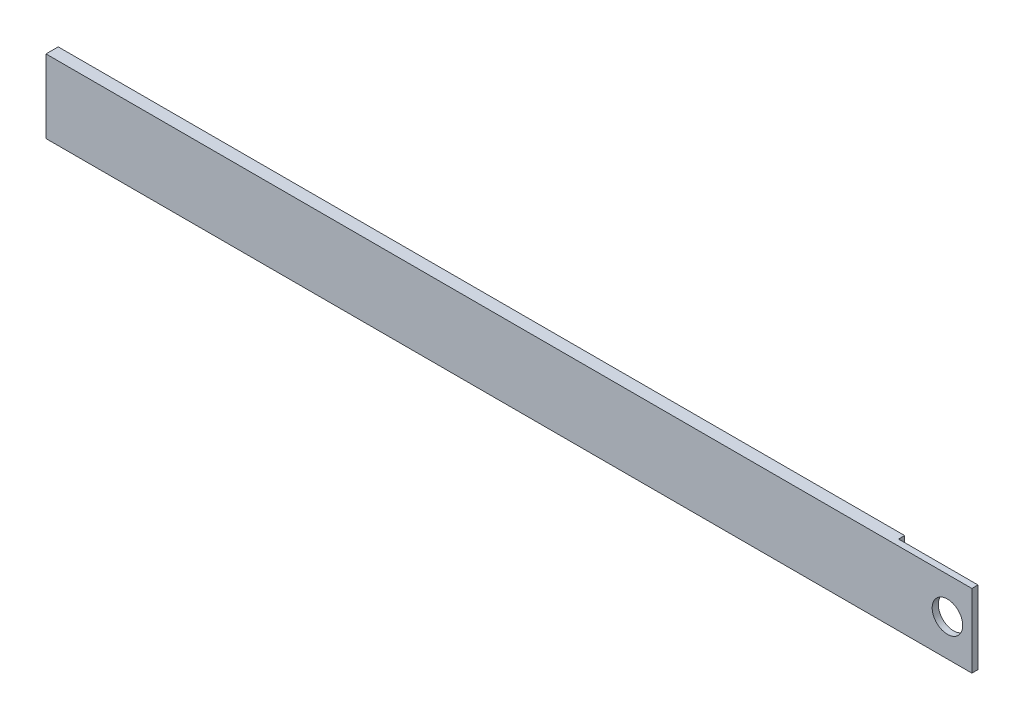
ISO-10303-21;
HEADER;
FILE_DESCRIPTION(('STEP AP214'),'2;1');
FILE_NAME('part.step','',(''),(''),'','','');
FILE_SCHEMA(('AUTOMOTIVE_DESIGN { 1 0 10303 214 1 1 1 1 }'));
ENDSEC;
DATA;
#1=APPLICATION_CONTEXT('core data for automotive mechanical design processes');
#2=APPLICATION_PROTOCOL_DEFINITION('international standard','automotive_design',2000,#1);
#3=PRODUCT_CONTEXT('',#1,'mechanical');
#4=PRODUCT('Part','Part','',(#3));
#5=PRODUCT_RELATED_PRODUCT_CATEGORY('part','',(#4));
#6=PRODUCT_DEFINITION_FORMATION('','',#4);
#7=PRODUCT_DEFINITION_CONTEXT('part definition',#1,'design');
#8=PRODUCT_DEFINITION('design','',#6,#7);
#9=PRODUCT_DEFINITION_SHAPE('','',#8);
#10=(LENGTH_UNIT() NAMED_UNIT(*) SI_UNIT(.MILLI.,.METRE.));
#11=(NAMED_UNIT(*) PLANE_ANGLE_UNIT() SI_UNIT($,.RADIAN.));
#12=(NAMED_UNIT(*) SI_UNIT($,.STERADIAN.) SOLID_ANGLE_UNIT());
#13=UNCERTAINTY_MEASURE_WITH_UNIT(LENGTH_MEASURE(1.E-05),#10,'distance_accuracy_value','');
#14=(GEOMETRIC_REPRESENTATION_CONTEXT(3) GLOBAL_UNCERTAINTY_ASSIGNED_CONTEXT((#13)) GLOBAL_UNIT_ASSIGNED_CONTEXT((#10,
#11,#12)) REPRESENTATION_CONTEXT('',''));
#15=CARTESIAN_POINT('',(0.,0.,0.));
#16=DIRECTION('',(0.,0.,1.));
#17=DIRECTION('',(1.,0.,0.));
#18=AXIS2_PLACEMENT_3D('',#15,#16,#17);
#19=CARTESIAN_POINT('',(-65.8443329061154,12.,-24.0382165605096));
#20=DIRECTION('',(0.,0.,-1.));
#21=DIRECTION('',(-1.,0.,0.));
#22=AXIS2_PLACEMENT_3D('',#19,#20,#21);
#23=PLANE('',#22);
#24=CARTESIAN_POINT('',(79.1556670938846,6.,-24.0382165605096));
#25=DIRECTION('',(0.,0.,1.));
#26=DIRECTION('',(1.,0.,0.));
#27=AXIS2_PLACEMENT_3D('',#24,#25,#26);
#28=CIRCLE('',#27,2.5);
#29=CARTESIAN_POINT('',(81.6556670938846,6.,-24.0382165605096));
#30=VERTEX_POINT('',#29);
#31=EDGE_CURVE('E127',#30,#30,#28,.T.);
#32=ORIENTED_EDGE('',*,*,#31,.F.);
#33=EDGE_LOOP('',(#32));
#34=FACE_BOUND('',#33,.T.);
#35=DIRECTION('',(1.,0.,0.));
#36=VECTOR('',#35,1.);
#37=CARTESIAN_POINT('',(-65.8443329061154,0.,-24.0382165605096));
#38=LINE('',#37,#36);
#39=CARTESIAN_POINT('',(-68.3443329061154,0.,-24.0382165605096));
#40=VERTEX_POINT('',#39);
#41=CARTESIAN_POINT('',(83.1556670938846,0.,-24.0382165605096));
#42=VERTEX_POINT('',#41);
#43=EDGE_CURVE('E72',#40,#42,#38,.T.);
#44=ORIENTED_EDGE('',*,*,#43,.T.);
#45=DIRECTION('',(0.,-1.,0.));
#46=VECTOR('',#45,1.);
#47=CARTESIAN_POINT('',(83.1556670938846,12.,-24.0382165605096));
#48=LINE('',#47,#46);
#49=CARTESIAN_POINT('',(83.1556670938846,12.,-24.0382165605096));
#50=VERTEX_POINT('',#49);
#51=EDGE_CURVE('E11',#50,#42,#48,.T.);
#52=ORIENTED_EDGE('',*,*,#51,.F.);
#53=DIRECTION('',(1.,0.,0.));
#54=VECTOR('',#53,1.);
#55=CARTESIAN_POINT('',(-68.3443329061154,12.,-24.0382165605096));
#56=LINE('',#55,#54);
#57=CARTESIAN_POINT('',(-68.3443329061154,12.,-24.0382165605096));
#58=VERTEX_POINT('',#57);
#59=EDGE_CURVE('E76',#58,#50,#56,.T.);
#60=ORIENTED_EDGE('',*,*,#59,.F.);
#61=DIRECTION('',(0.,-1.,0.));
#62=VECTOR('',#61,1.);
#63=CARTESIAN_POINT('',(-68.3443329061154,12.,-24.0382165605096));
#64=LINE('',#63,#62);
#65=EDGE_CURVE('E119',#58,#40,#64,.T.);
#66=ORIENTED_EDGE('',*,*,#65,.T.);
#67=EDGE_LOOP('',(#44,#52,#60,#66));
#68=FACE_BOUND('',#67,.T.);
#69=ADVANCED_FACE('F32',(#34,#68),#23,.F.);
#70=CARTESIAN_POINT('',(83.1556670938846,12.,-24.0382165605096));
#71=DIRECTION('',(-1.,0.,0.));
#72=DIRECTION('',(0.,0.,1.));
#73=AXIS2_PLACEMENT_3D('',#70,#71,#72);
#74=PLANE('',#73);
#75=DIRECTION('',(0.,0.,-1.));
#76=VECTOR('',#75,1.);
#77=CARTESIAN_POINT('',(83.1556670938846,0.,-24.0382165605096));
#78=LINE('',#77,#76);
#79=CARTESIAN_POINT('',(83.1556670938846,0.,-25.0382165605096));
#80=VERTEX_POINT('',#79);
#81=EDGE_CURVE('E112',#42,#80,#78,.T.);
#82=ORIENTED_EDGE('',*,*,#81,.T.);
#83=DIRECTION('',(0.,1.,0.));
#84=VECTOR('',#83,1.);
#85=CARTESIAN_POINT('',(83.1556670938846,0.,-25.0382165605096));
#86=LINE('',#85,#84);
#87=CARTESIAN_POINT('',(83.1556670938846,12.,-25.0382165605096));
#88=VERTEX_POINT('',#87);
#89=EDGE_CURVE('E135',#80,#88,#86,.T.);
#90=ORIENTED_EDGE('',*,*,#89,.T.);
#91=DIRECTION('',(0.,0.,-1.));
#92=VECTOR('',#91,1.);
#93=CARTESIAN_POINT('',(83.1556670938846,12.,-24.0382165605096));
#94=LINE('',#93,#92);
#95=EDGE_CURVE('E124',#50,#88,#94,.T.);
#96=ORIENTED_EDGE('',*,*,#95,.F.);
#97=ORIENTED_EDGE('',*,*,#51,.T.);
#98=EDGE_LOOP('',(#82,#90,#96,#97));
#99=FACE_BOUND('',#98,.T.);
#100=ADVANCED_FACE('F143',(#99),#74,.F.);
#101=CARTESIAN_POINT('',(-65.8443329061154,12.,-26.0382165605096));
#102=DIRECTION('',(0.,0.,1.));
#103=DIRECTION('',(1.,0.,0.));
#104=AXIS2_PLACEMENT_3D('',#101,#102,#103);
#105=PLANE('',#104);
#106=DIRECTION('',(-1.,0.,0.));
#107=VECTOR('',#106,1.);
#108=CARTESIAN_POINT('',(-65.8443329061154,12.,-26.0382165605096));
#109=LINE('',#108,#107);
#110=CARTESIAN_POINT('',(70.1556670938846,12.,-26.0382165605096));
#111=VERTEX_POINT('',#110);
#112=CARTESIAN_POINT('',(-68.3443329061154,12.,-26.0382165605096));
#113=VERTEX_POINT('',#112);
#114=EDGE_CURVE('E108',#111,#113,#109,.T.);
#115=ORIENTED_EDGE('',*,*,#114,.F.);
#116=DIRECTION('',(0.,1.,0.));
#117=VECTOR('',#116,1.);
#118=CARTESIAN_POINT('',(70.1556670938846,0.,-26.0382165605096));
#119=LINE('',#118,#117);
#120=CARTESIAN_POINT('',(70.1556670938846,0.,-26.0382165605096));
#121=VERTEX_POINT('',#120);
#122=EDGE_CURVE('E96',#121,#111,#119,.T.);
#123=ORIENTED_EDGE('',*,*,#122,.F.);
#124=DIRECTION('',(-1.,0.,0.));
#125=VECTOR('',#124,1.);
#126=CARTESIAN_POINT('',(-65.8443329061154,0.,-26.0382165605096));
#127=LINE('',#126,#125);
#128=CARTESIAN_POINT('',(-68.3443329061154,0.,-26.0382165605096));
#129=VERTEX_POINT('',#128);
#130=EDGE_CURVE('E106',#121,#129,#127,.T.);
#131=ORIENTED_EDGE('',*,*,#130,.T.);
#132=DIRECTION('',(0.,-1.,0.));
#133=VECTOR('',#132,1.);
#134=CARTESIAN_POINT('',(-68.3443329061154,12.,-26.0382165605096));
#135=LINE('',#134,#133);
#136=EDGE_CURVE('E39',#113,#129,#135,.T.);
#137=ORIENTED_EDGE('',*,*,#136,.F.);
#138=EDGE_LOOP('',(#115,#123,#131,#137));
#139=FACE_BOUND('',#138,.T.);
#140=ADVANCED_FACE('F104',(#139),#105,.F.);
#141=CARTESIAN_POINT('',(-68.3443329061154,12.,-26.0382165605096));
#142=DIRECTION('',(1.,0.,0.));
#143=DIRECTION('',(0.,0.,-1.));
#144=AXIS2_PLACEMENT_3D('',#141,#142,#143);
#145=PLANE('',#144);
#146=DIRECTION('',(0.,0.,1.));
#147=VECTOR('',#146,1.);
#148=CARTESIAN_POINT('',(-68.3443329061154,0.,-26.0382165605096));
#149=LINE('',#148,#147);
#150=EDGE_CURVE('E111',#129,#40,#149,.T.);
#151=ORIENTED_EDGE('',*,*,#150,.T.);
#152=ORIENTED_EDGE('',*,*,#65,.F.);
#153=DIRECTION('',(0.,0.,1.));
#154=VECTOR('',#153,1.);
#155=CARTESIAN_POINT('',(-68.3443329061154,12.,-26.0382165605096));
#156=LINE('',#155,#154);
#157=EDGE_CURVE('E55',#113,#58,#156,.T.);
#158=ORIENTED_EDGE('',*,*,#157,.F.);
#159=ORIENTED_EDGE('',*,*,#136,.T.);
#160=EDGE_LOOP('',(#151,#152,#158,#159));
#161=FACE_BOUND('',#160,.T.);
#162=ADVANCED_FACE('F122',(#161),#145,.F.);
#163=CARTESIAN_POINT('',(0.,12.,0.));
#164=DIRECTION('',(0.,1.,0.));
#165=DIRECTION('',(0.,0.,1.));
#166=AXIS2_PLACEMENT_3D('',#163,#164,#165);
#167=PLANE('',#166);
#168=DIRECTION('',(1.,0.,0.));
#169=VECTOR('',#168,1.);
#170=CARTESIAN_POINT('',(83.1556670938846,12.,-25.0382165605096));
#171=LINE('',#170,#169);
#172=CARTESIAN_POINT('',(70.1556670938846,12.,-25.0382165605096));
#173=VERTEX_POINT('',#172);
#174=EDGE_CURVE('E100',#173,#88,#171,.T.);
#175=ORIENTED_EDGE('',*,*,#174,.F.);
#176=DIRECTION('',(0.,0.,1.));
#177=VECTOR('',#176,1.);
#178=CARTESIAN_POINT('',(70.1556670938846,12.,-25.0382165605096));
#179=LINE('',#178,#177);
#180=EDGE_CURVE('E148',#111,#173,#179,.T.);
#181=ORIENTED_EDGE('',*,*,#180,.F.);
#182=ORIENTED_EDGE('',*,*,#114,.T.);
#183=ORIENTED_EDGE('',*,*,#157,.T.);
#184=ORIENTED_EDGE('',*,*,#59,.T.);
#185=ORIENTED_EDGE('',*,*,#95,.T.);
#186=EDGE_LOOP('',(#175,#181,#182,#183,#184,#185));
#187=FACE_BOUND('',#186,.T.);
#188=ADVANCED_FACE('F140',(#187),#167,.T.);
#189=CARTESIAN_POINT('',(0.,0.,0.));
#190=DIRECTION('',(0.,1.,0.));
#191=DIRECTION('',(0.,0.,1.));
#192=AXIS2_PLACEMENT_3D('',#189,#190,#191);
#193=PLANE('',#192);
#194=DIRECTION('',(0.,0.,1.));
#195=VECTOR('',#194,1.);
#196=CARTESIAN_POINT('',(70.1556670938846,0.,-25.0382165605096));
#197=LINE('',#196,#195);
#198=CARTESIAN_POINT('',(70.1556670938846,0.,-25.0382165605096));
#199=VERTEX_POINT('',#198);
#200=EDGE_CURVE('E92',#121,#199,#197,.T.);
#201=ORIENTED_EDGE('',*,*,#200,.T.);
#202=DIRECTION('',(1.,0.,0.));
#203=VECTOR('',#202,1.);
#204=CARTESIAN_POINT('',(83.1556670938846,0.,-25.0382165605096));
#205=LINE('',#204,#203);
#206=EDGE_CURVE('E46',#199,#80,#205,.T.);
#207=ORIENTED_EDGE('',*,*,#206,.T.);
#208=ORIENTED_EDGE('',*,*,#81,.F.);
#209=ORIENTED_EDGE('',*,*,#43,.F.);
#210=ORIENTED_EDGE('',*,*,#150,.F.);
#211=ORIENTED_EDGE('',*,*,#130,.F.);
#212=EDGE_LOOP('',(#201,#207,#208,#209,#210,#211));
#213=FACE_BOUND('',#212,.T.);
#214=ADVANCED_FACE('F110',(#213),#193,.F.);
#215=CARTESIAN_POINT('',(79.1556670938846,6.,-25.0382165605096));
#216=DIRECTION('',(0.,0.,1.));
#217=DIRECTION('',(1.,0.,0.));
#218=AXIS2_PLACEMENT_3D('',#215,#216,#217);
#219=CYLINDRICAL_SURFACE('',#218,2.5);
#220=CARTESIAN_POINT('',(79.1556670938846,6.,-25.0382165605096));
#221=DIRECTION('',(0.,0.,1.));
#222=DIRECTION('',(1.,0.,0.));
#223=AXIS2_PLACEMENT_3D('',#220,#221,#222);
#224=CIRCLE('',#223,2.5);
#225=CARTESIAN_POINT('',(81.6556670938846,6.,-25.0382165605096));
#226=VERTEX_POINT('',#225);
#227=EDGE_CURVE('E130',#226,#226,#224,.F.);
#228=ORIENTED_EDGE('',*,*,#227,.T.);
#229=EDGE_LOOP('',(#228));
#230=FACE_BOUND('',#229,.T.);
#231=ORIENTED_EDGE('',*,*,#31,.T.);
#232=EDGE_LOOP('',(#231));
#233=FACE_BOUND('',#232,.T.);
#234=ADVANCED_FACE('F153',(#230,#233),#219,.F.);
#235=CARTESIAN_POINT('',(83.1556670938846,0.,-25.0382165605096));
#236=DIRECTION('',(0.,0.,1.));
#237=DIRECTION('',(1.,0.,0.));
#238=AXIS2_PLACEMENT_3D('',#235,#236,#237);
#239=PLANE('',#238);
#240=ORIENTED_EDGE('',*,*,#174,.T.);
#241=ORIENTED_EDGE('',*,*,#89,.F.);
#242=ORIENTED_EDGE('',*,*,#206,.F.);
#243=DIRECTION('',(0.,1.,0.));
#244=VECTOR('',#243,1.);
#245=CARTESIAN_POINT('',(70.1556670938846,0.,-25.0382165605096));
#246=LINE('',#245,#244);
#247=EDGE_CURVE('E98',#199,#173,#246,.T.);
#248=ORIENTED_EDGE('',*,*,#247,.T.);
#249=EDGE_LOOP('',(#240,#241,#242,#248));
#250=FACE_BOUND('',#249,.T.);
#251=ORIENTED_EDGE('',*,*,#227,.F.);
#252=EDGE_LOOP('',(#251));
#253=FACE_BOUND('',#252,.T.);
#254=ADVANCED_FACE('F150',(#250,#253),#239,.F.);
#255=CARTESIAN_POINT('',(70.1556670938846,0.,-25.0382165605096));
#256=DIRECTION('',(-1.,0.,0.));
#257=DIRECTION('',(0.,0.,1.));
#258=AXIS2_PLACEMENT_3D('',#255,#256,#257);
#259=PLANE('',#258);
#260=ORIENTED_EDGE('',*,*,#180,.T.);
#261=ORIENTED_EDGE('',*,*,#247,.F.);
#262=ORIENTED_EDGE('',*,*,#200,.F.);
#263=ORIENTED_EDGE('',*,*,#122,.T.);
#264=EDGE_LOOP('',(#260,#261,#262,#263));
#265=FACE_BOUND('',#264,.T.);
#266=ADVANCED_FACE('F95',(#265),#259,.F.);
#267=CLOSED_SHELL('',(#69,#100,#140,#162,#188,#214,#234,#254,#266));
#268=MANIFOLD_SOLID_BREP('B2',#267);
#269=ADVANCED_BREP_SHAPE_REPRESENTATION('',(#18,#268),#14);
#270=SHAPE_DEFINITION_REPRESENTATION(#9,#269);
ENDSEC;
END-ISO-10303-21;
